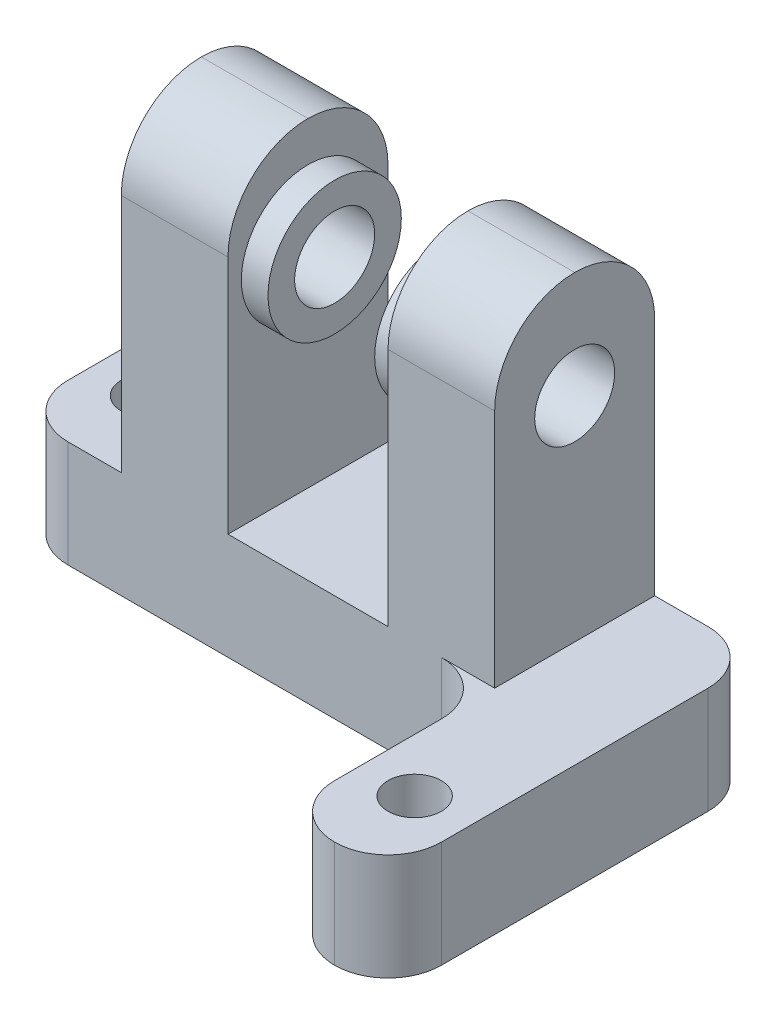
ISO-10303-21;
HEADER;
FILE_DESCRIPTION(('STEP AP214'),'2;1');
FILE_NAME('part.step','',(''),(''),'','','');
FILE_SCHEMA(('AUTOMOTIVE_DESIGN { 1 0 10303 214 1 1 1 1 }'));
ENDSEC;
DATA;
#1=APPLICATION_CONTEXT('core data for automotive mechanical design processes');
#2=APPLICATION_PROTOCOL_DEFINITION('international standard','automotive_design',2000,#1);
#3=PRODUCT_CONTEXT('',#1,'mechanical');
#4=PRODUCT('Part','Part','',(#3));
#5=PRODUCT_RELATED_PRODUCT_CATEGORY('part','',(#4));
#6=PRODUCT_DEFINITION_FORMATION('','',#4);
#7=PRODUCT_DEFINITION_CONTEXT('part definition',#1,'design');
#8=PRODUCT_DEFINITION('design','',#6,#7);
#9=PRODUCT_DEFINITION_SHAPE('','',#8);
#10=(LENGTH_UNIT() NAMED_UNIT(*) SI_UNIT(.MILLI.,.METRE.));
#11=(NAMED_UNIT(*) PLANE_ANGLE_UNIT() SI_UNIT($,.RADIAN.));
#12=(NAMED_UNIT(*) SI_UNIT($,.STERADIAN.) SOLID_ANGLE_UNIT());
#13=UNCERTAINTY_MEASURE_WITH_UNIT(LENGTH_MEASURE(1.E-05),#10,'distance_accuracy_value','');
#14=(GEOMETRIC_REPRESENTATION_CONTEXT(3) GLOBAL_UNCERTAINTY_ASSIGNED_CONTEXT((#13)) GLOBAL_UNIT_ASSIGNED_CONTEXT((#10,
#11,#12)) REPRESENTATION_CONTEXT('',''));
#15=CARTESIAN_POINT('',(0.,0.,0.));
#16=DIRECTION('',(0.,0.,1.));
#17=DIRECTION('',(1.,0.,0.));
#18=AXIS2_PLACEMENT_3D('',#15,#16,#17);
#19=CARTESIAN_POINT('',(-7.,4.,-3.));
#20=DIRECTION('',(1.,0.,0.));
#21=DIRECTION('',(0.,0.,-1.));
#22=AXIS2_PLACEMENT_3D('',#19,#20,#21);
#23=PLANE('',#22);
#24=CARTESIAN_POINT('',(-7.,12.,0.));
#25=DIRECTION('',(1.,0.,0.));
#26=DIRECTION('',(0.,0.,-1.));
#27=AXIS2_PLACEMENT_3D('',#24,#25,#26);
#28=CIRCLE('',#27,1.5);
#29=CARTESIAN_POINT('',(-7.,12.,-1.5));
#30=VERTEX_POINT('',#29);
#31=EDGE_CURVE('E254',#30,#30,#28,.T.);
#32=ORIENTED_EDGE('',*,*,#31,.T.);
#33=EDGE_LOOP('',(#32));
#34=FACE_BOUND('',#33,.T.);
#35=CARTESIAN_POINT('',(-7.,13.,0.));
#36=DIRECTION('',(1.,0.,0.));
#37=DIRECTION('',(0.,0.,-1.));
#38=AXIS2_PLACEMENT_3D('',#35,#36,#37);
#39=CIRCLE('',#38,3.);
#40=CARTESIAN_POINT('',(-7.,13.,3.));
#41=VERTEX_POINT('',#40);
#42=CARTESIAN_POINT('',(-7.,16.,0.));
#43=VERTEX_POINT('',#42);
#44=EDGE_CURVE('E346',#41,#43,#39,.F.);
#45=ORIENTED_EDGE('',*,*,#44,.T.);
#46=CARTESIAN_POINT('',(-7.,13.,0.));
#47=DIRECTION('',(1.,0.,0.));
#48=DIRECTION('',(0.,0.,-1.));
#49=AXIS2_PLACEMENT_3D('',#46,#47,#48);
#50=CIRCLE('',#49,3.);
#51=CARTESIAN_POINT('',(-7.,13.,-3.));
#52=VERTEX_POINT('',#51);
#53=EDGE_CURVE('E184',#43,#52,#50,.F.);
#54=ORIENTED_EDGE('',*,*,#53,.T.);
#55=DIRECTION('',(0.,-1.,0.));
#56=VECTOR('',#55,1.);
#57=CARTESIAN_POINT('',(-7.,4.,-3.));
#58=LINE('',#57,#56);
#59=CARTESIAN_POINT('',(-7.,4.,-3.));
#60=VERTEX_POINT('',#59);
#61=EDGE_CURVE('E178',#52,#60,#58,.T.);
#62=ORIENTED_EDGE('',*,*,#61,.T.);
#63=DIRECTION('',(0.,0.,-1.));
#64=VECTOR('',#63,1.);
#65=CARTESIAN_POINT('',(-7.,4.,3.));
#66=LINE('',#65,#64);
#67=CARTESIAN_POINT('',(-7.,4.,3.));
#68=VERTEX_POINT('',#67);
#69=EDGE_CURVE('E182',#68,#60,#66,.T.);
#70=ORIENTED_EDGE('',*,*,#69,.F.);
#71=DIRECTION('',(0.,-1.,0.));
#72=VECTOR('',#71,1.);
#73=CARTESIAN_POINT('',(-7.,4.,3.));
#74=LINE('',#73,#72);
#75=EDGE_CURVE('E189',#41,#68,#74,.T.);
#76=ORIENTED_EDGE('',*,*,#75,.F.);
#77=EDGE_LOOP('',(#45,#54,#62,#70,#76));
#78=FACE_BOUND('',#77,.T.);
#79=ADVANCED_FACE('F36',(#34,#78),#23,.F.);
#80=CARTESIAN_POINT('',(7.,4.,-3.));
#81=DIRECTION('',(-1.,0.,0.));
#82=DIRECTION('',(0.,0.,1.));
#83=AXIS2_PLACEMENT_3D('',#80,#81,#82);
#84=PLANE('',#83);
#85=CARTESIAN_POINT('',(7.,12.,0.));
#86=DIRECTION('',(-1.,0.,0.));
#87=DIRECTION('',(0.,0.,1.));
#88=AXIS2_PLACEMENT_3D('',#85,#86,#87);
#89=CIRCLE('',#88,1.5);
#90=CARTESIAN_POINT('',(7.,12.,1.5));
#91=VERTEX_POINT('',#90);
#92=EDGE_CURVE('E257',#91,#91,#89,.T.);
#93=ORIENTED_EDGE('',*,*,#92,.T.);
#94=EDGE_LOOP('',(#93));
#95=FACE_BOUND('',#94,.T.);
#96=DIRECTION('',(0.,-1.,0.));
#97=VECTOR('',#96,1.);
#98=CARTESIAN_POINT('',(7.,4.,-3.));
#99=LINE('',#98,#97);
#100=CARTESIAN_POINT('',(7.,13.,-3.));
#101=VERTEX_POINT('',#100);
#102=CARTESIAN_POINT('',(7.,4.,-3.));
#103=VERTEX_POINT('',#102);
#104=EDGE_CURVE('E188',#101,#103,#99,.T.);
#105=ORIENTED_EDGE('',*,*,#104,.F.);
#106=CARTESIAN_POINT('',(7.,13.,0.));
#107=DIRECTION('',(-1.,0.,0.));
#108=DIRECTION('',(0.,0.,1.));
#109=AXIS2_PLACEMENT_3D('',#106,#107,#108);
#110=CIRCLE('',#109,3.);
#111=CARTESIAN_POINT('',(7.,16.,0.));
#112=VERTEX_POINT('',#111);
#113=EDGE_CURVE('E58',#101,#112,#110,.F.);
#114=ORIENTED_EDGE('',*,*,#113,.T.);
#115=CARTESIAN_POINT('',(7.,13.,0.));
#116=DIRECTION('',(-1.,0.,0.));
#117=DIRECTION('',(0.,0.,1.));
#118=AXIS2_PLACEMENT_3D('',#115,#116,#117);
#119=CIRCLE('',#118,3.);
#120=CARTESIAN_POINT('',(7.,13.,3.));
#121=VERTEX_POINT('',#120);
#122=EDGE_CURVE('E53',#112,#121,#119,.F.);
#123=ORIENTED_EDGE('',*,*,#122,.T.);
#124=DIRECTION('',(0.,-1.,0.));
#125=VECTOR('',#124,1.);
#126=CARTESIAN_POINT('',(7.,4.,3.));
#127=LINE('',#126,#125);
#128=CARTESIAN_POINT('',(7.,4.,3.));
#129=VERTEX_POINT('',#128);
#130=EDGE_CURVE('E282',#121,#129,#127,.T.);
#131=ORIENTED_EDGE('',*,*,#130,.T.);
#132=DIRECTION('',(0.,0.,1.));
#133=VECTOR('',#132,1.);
#134=CARTESIAN_POINT('',(7.,4.,-3.));
#135=LINE('',#134,#133);
#136=EDGE_CURVE('E231',#103,#129,#135,.T.);
#137=ORIENTED_EDGE('',*,*,#136,.F.);
#138=EDGE_LOOP('',(#105,#114,#123,#131,#137));
#139=FACE_BOUND('',#138,.T.);
#140=ADVANCED_FACE('F453',(#95,#139),#84,.F.);
#141=CARTESIAN_POINT('',(3.,16.,3.));
#142=DIRECTION('',(1.,0.,0.));
#143=DIRECTION('',(0.,0.,-1.));
#144=AXIS2_PLACEMENT_3D('',#141,#142,#143);
#145=PLANE('',#144);
#146=CARTESIAN_POINT('',(3.,13.,0.));
#147=DIRECTION('',(1.,0.,0.));
#148=DIRECTION('',(0.,0.,-1.));
#149=AXIS2_PLACEMENT_3D('',#146,#147,#148);
#150=CIRCLE('',#149,3.);
#151=CARTESIAN_POINT('',(3.,13.,3.));
#152=VERTEX_POINT('',#151);
#153=CARTESIAN_POINT('',(3.,16.,0.));
#154=VERTEX_POINT('',#153);
#155=EDGE_CURVE('E361',#152,#154,#150,.F.);
#156=ORIENTED_EDGE('',*,*,#155,.T.);
#157=CARTESIAN_POINT('',(3.,13.,0.));
#158=DIRECTION('',(1.,0.,0.));
#159=DIRECTION('',(0.,0.,-1.));
#160=AXIS2_PLACEMENT_3D('',#157,#158,#159);
#161=CIRCLE('',#160,3.);
#162=CARTESIAN_POINT('',(3.,13.,-3.));
#163=VERTEX_POINT('',#162);
#164=EDGE_CURVE('E363',#154,#163,#161,.F.);
#165=ORIENTED_EDGE('',*,*,#164,.T.);
#166=DIRECTION('',(0.,-1.,0.));
#167=VECTOR('',#166,1.);
#168=CARTESIAN_POINT('',(3.,16.,-3.));
#169=LINE('',#168,#167);
#170=CARTESIAN_POINT('',(3.,4.,-3.));
#171=VERTEX_POINT('',#170);
#172=EDGE_CURVE('E260',#163,#171,#169,.T.);
#173=ORIENTED_EDGE('',*,*,#172,.T.);
#174=DIRECTION('',(0.,0.,1.));
#175=VECTOR('',#174,1.);
#176=CARTESIAN_POINT('',(3.,4.,3.));
#177=LINE('',#176,#175);
#178=CARTESIAN_POINT('',(3.,4.,3.));
#179=VERTEX_POINT('',#178);
#180=EDGE_CURVE('E264',#171,#179,#177,.T.);
#181=ORIENTED_EDGE('',*,*,#180,.T.);
#182=DIRECTION('',(0.,-1.,0.));
#183=VECTOR('',#182,1.);
#184=CARTESIAN_POINT('',(3.,16.,3.));
#185=LINE('',#184,#183);
#186=EDGE_CURVE('E262',#152,#179,#185,.T.);
#187=ORIENTED_EDGE('',*,*,#186,.F.);
#188=EDGE_LOOP('',(#156,#165,#173,#181,#187));
#189=FACE_BOUND('',#188,.T.);
#190=CARTESIAN_POINT('',(3.,12.,0.));
#191=DIRECTION('',(1.,0.,0.));
#192=DIRECTION('',(0.,0.,-1.));
#193=AXIS2_PLACEMENT_3D('',#190,#191,#192);
#194=CIRCLE('',#193,2.5);
#195=CARTESIAN_POINT('',(3.,12.,-2.5));
#196=VERTEX_POINT('',#195);
#197=EDGE_CURVE('E292',#196,#196,#194,.F.);
#198=ORIENTED_EDGE('',*,*,#197,.F.);
#199=EDGE_LOOP('',(#198));
#200=FACE_BOUND('',#199,.T.);
#201=ADVANCED_FACE('F384',(#189,#200),#145,.F.);
#202=CARTESIAN_POINT('',(-3.,16.,3.));
#203=DIRECTION('',(-1.,0.,0.));
#204=DIRECTION('',(0.,0.,1.));
#205=AXIS2_PLACEMENT_3D('',#202,#203,#204);
#206=PLANE('',#205);
#207=DIRECTION('',(0.,-1.,0.));
#208=VECTOR('',#207,1.);
#209=CARTESIAN_POINT('',(-3.,16.,-3.));
#210=LINE('',#209,#208);
#211=CARTESIAN_POINT('',(-3.,13.,-3.));
#212=VERTEX_POINT('',#211);
#213=CARTESIAN_POINT('',(-3.,4.,-3.));
#214=VERTEX_POINT('',#213);
#215=EDGE_CURVE('E270',#212,#214,#210,.T.);
#216=ORIENTED_EDGE('',*,*,#215,.F.);
#217=CARTESIAN_POINT('',(-3.,13.,0.));
#218=DIRECTION('',(-1.,0.,0.));
#219=DIRECTION('',(0.,0.,1.));
#220=AXIS2_PLACEMENT_3D('',#217,#218,#219);
#221=CIRCLE('',#220,3.);
#222=CARTESIAN_POINT('',(-3.,16.,0.));
#223=VERTEX_POINT('',#222);
#224=EDGE_CURVE('E359',#212,#223,#221,.F.);
#225=ORIENTED_EDGE('',*,*,#224,.T.);
#226=CARTESIAN_POINT('',(-3.,13.,0.));
#227=DIRECTION('',(-1.,0.,0.));
#228=DIRECTION('',(0.,0.,1.));
#229=AXIS2_PLACEMENT_3D('',#226,#227,#228);
#230=CIRCLE('',#229,3.);
#231=CARTESIAN_POINT('',(-3.,13.,3.));
#232=VERTEX_POINT('',#231);
#233=EDGE_CURVE('E357',#223,#232,#230,.F.);
#234=ORIENTED_EDGE('',*,*,#233,.T.);
#235=DIRECTION('',(0.,-1.,0.));
#236=VECTOR('',#235,1.);
#237=CARTESIAN_POINT('',(-3.,16.,3.));
#238=LINE('',#237,#236);
#239=CARTESIAN_POINT('',(-3.,4.,3.));
#240=VERTEX_POINT('',#239);
#241=EDGE_CURVE('E272',#232,#240,#238,.T.);
#242=ORIENTED_EDGE('',*,*,#241,.T.);
#243=DIRECTION('',(0.,0.,-1.));
#244=VECTOR('',#243,1.);
#245=CARTESIAN_POINT('',(-3.,4.,3.));
#246=LINE('',#245,#244);
#247=EDGE_CURVE('E267',#240,#214,#246,.T.);
#248=ORIENTED_EDGE('',*,*,#247,.T.);
#249=EDGE_LOOP('',(#216,#225,#234,#242,#248));
#250=FACE_BOUND('',#249,.T.);
#251=CARTESIAN_POINT('',(-3.,12.,0.));
#252=DIRECTION('',(-1.,0.,0.));
#253=DIRECTION('',(0.,0.,1.));
#254=AXIS2_PLACEMENT_3D('',#251,#252,#253);
#255=CIRCLE('',#254,2.5);
#256=CARTESIAN_POINT('',(-3.,12.,2.5));
#257=VERTEX_POINT('',#256);
#258=EDGE_CURVE('E289',#257,#257,#255,.F.);
#259=ORIENTED_EDGE('',*,*,#258,.F.);
#260=EDGE_LOOP('',(#259));
#261=FACE_BOUND('',#260,.T.);
#262=ADVANCED_FACE('F394',(#250,#261),#206,.F.);
#263=CARTESIAN_POINT('',(0.,4.,0.));
#264=DIRECTION('',(0.,1.,0.));
#265=DIRECTION('',(0.,0.,1.));
#266=AXIS2_PLACEMENT_3D('',#263,#264,#265);
#267=PLANE('',#266);
#268=DIRECTION('',(1.,0.,0.));
#269=VECTOR('',#268,1.);
#270=CARTESIAN_POINT('',(-7.,4.,3.));
#271=LINE('',#270,#269);
#272=EDGE_CURVE('E278',#240,#179,#271,.T.);
#273=ORIENTED_EDGE('',*,*,#272,.T.);
#274=ORIENTED_EDGE('',*,*,#180,.F.);
#275=DIRECTION('',(-1.,0.,0.));
#276=VECTOR('',#275,1.);
#277=CARTESIAN_POINT('',(-7.,4.,-3.));
#278=LINE('',#277,#276);
#279=EDGE_CURVE('E275',#171,#214,#278,.T.);
#280=ORIENTED_EDGE('',*,*,#279,.T.);
#281=ORIENTED_EDGE('',*,*,#247,.F.);
#282=EDGE_LOOP('',(#273,#274,#280,#281));
#283=FACE_BOUND('',#282,.T.);
#284=ADVANCED_FACE('F390',(#283),#267,.T.);
#285=CARTESIAN_POINT('',(-7.,4.,-3.));
#286=DIRECTION('',(0.,0.,1.));
#287=DIRECTION('',(1.,0.,0.));
#288=AXIS2_PLACEMENT_3D('',#285,#286,#287);
#289=PLANE('',#288);
#290=ORIENTED_EDGE('',*,*,#61,.F.);
#291=DIRECTION('',(-1.,0.,0.));
#292=VECTOR('',#291,1.);
#293=CARTESIAN_POINT('',(-3.,13.,-3.));
#294=LINE('',#293,#292);
#295=EDGE_CURVE('E355',#52,#212,#294,.F.);
#296=ORIENTED_EDGE('',*,*,#295,.T.);
#297=ORIENTED_EDGE('',*,*,#215,.T.);
#298=ORIENTED_EDGE('',*,*,#279,.F.);
#299=ORIENTED_EDGE('',*,*,#172,.F.);
#300=DIRECTION('',(-1.,0.,0.));
#301=VECTOR('',#300,1.);
#302=CARTESIAN_POINT('',(-7.,13.,-3.));
#303=LINE('',#302,#301);
#304=EDGE_CURVE('E352',#163,#101,#303,.F.);
#305=ORIENTED_EDGE('',*,*,#304,.T.);
#306=ORIENTED_EDGE('',*,*,#104,.T.);
#307=DIRECTION('',(-1.,0.,0.));
#308=VECTOR('',#307,1.);
#309=CARTESIAN_POINT('',(11.,4.,-3.));
#310=LINE('',#309,#308);
#311=CARTESIAN_POINT('',(9.,4.,-3.));
#312=VERTEX_POINT('',#311);
#313=EDGE_CURVE('E237',#312,#103,#310,.T.);
#314=ORIENTED_EDGE('',*,*,#313,.F.);
#315=DIRECTION('',(0.,1.,0.));
#316=VECTOR('',#315,1.);
#317=CARTESIAN_POINT('',(9.,0.,-3.));
#318=LINE('',#317,#316);
#319=CARTESIAN_POINT('',(8.99999999999999,0.,-3.));
#320=VERTEX_POINT('',#319);
#321=EDGE_CURVE('E340',#312,#320,#318,.F.);
#322=ORIENTED_EDGE('',*,*,#321,.T.);
#323=DIRECTION('',(-1.,0.,0.));
#324=VECTOR('',#323,1.);
#325=CARTESIAN_POINT('',(-7.,0.,-3.));
#326=LINE('',#325,#324);
#327=CARTESIAN_POINT('',(-9.,0.,-3.));
#328=VERTEX_POINT('',#327);
#329=EDGE_CURVE('E274',#320,#328,#326,.T.);
#330=ORIENTED_EDGE('',*,*,#329,.T.);
#331=DIRECTION('',(0.,1.,0.));
#332=VECTOR('',#331,1.);
#333=CARTESIAN_POINT('',(-9.,4.,-3.));
#334=LINE('',#333,#332);
#335=CARTESIAN_POINT('',(-9.,4.,-3.));
#336=VERTEX_POINT('',#335);
#337=EDGE_CURVE('E197',#328,#336,#334,.T.);
#338=ORIENTED_EDGE('',*,*,#337,.T.);
#339=DIRECTION('',(-1.,0.,0.));
#340=VECTOR('',#339,1.);
#341=CARTESIAN_POINT('',(-7.,4.,-3.));
#342=LINE('',#341,#340);
#343=EDGE_CURVE('E193',#60,#336,#342,.T.);
#344=ORIENTED_EDGE('',*,*,#343,.F.);
#345=EDGE_LOOP('',(#290,#296,#297,#298,#299,#305,#306,#314,#322,#330,#338,#344));
#346=FACE_BOUND('',#345,.T.);
#347=ADVANCED_FACE('F194',(#346),#289,.F.);
#348=CARTESIAN_POINT('',(-7.,4.,3.));
#349=DIRECTION('',(0.,0.,-1.));
#350=DIRECTION('',(-1.,0.,0.));
#351=AXIS2_PLACEMENT_3D('',#348,#349,#350);
#352=PLANE('',#351);
#353=ORIENTED_EDGE('',*,*,#130,.F.);
#354=DIRECTION('',(1.,0.,0.));
#355=VECTOR('',#354,1.);
#356=CARTESIAN_POINT('',(-7.,13.,3.));
#357=LINE('',#356,#355);
#358=EDGE_CURVE('E11',#121,#152,#357,.F.);
#359=ORIENTED_EDGE('',*,*,#358,.T.);
#360=ORIENTED_EDGE('',*,*,#186,.T.);
#361=ORIENTED_EDGE('',*,*,#272,.F.);
#362=ORIENTED_EDGE('',*,*,#241,.F.);
#363=DIRECTION('',(1.,0.,0.));
#364=VECTOR('',#363,1.);
#365=CARTESIAN_POINT('',(-7.,13.,3.));
#366=LINE('',#365,#364);
#367=EDGE_CURVE('E45',#232,#41,#366,.F.);
#368=ORIENTED_EDGE('',*,*,#367,.T.);
#369=ORIENTED_EDGE('',*,*,#75,.T.);
#370=DIRECTION('',(1.,0.,0.));
#371=VECTOR('',#370,1.);
#372=CARTESIAN_POINT('',(-11.,4.,3.));
#373=LINE('',#372,#371);
#374=CARTESIAN_POINT('',(-9.,4.,3.));
#375=VERTEX_POINT('',#374);
#376=EDGE_CURVE('E205',#375,#68,#373,.T.);
#377=ORIENTED_EDGE('',*,*,#376,.F.);
#378=DIRECTION('',(0.,1.,0.));
#379=VECTOR('',#378,1.);
#380=CARTESIAN_POINT('',(-9.,0.,3.));
#381=LINE('',#380,#379);
#382=CARTESIAN_POINT('',(-9.,0.,3.));
#383=VERTEX_POINT('',#382);
#384=EDGE_CURVE('E300',#375,#383,#381,.F.);
#385=ORIENTED_EDGE('',*,*,#384,.T.);
#386=DIRECTION('',(1.,0.,0.));
#387=VECTOR('',#386,1.);
#388=CARTESIAN_POINT('',(-7.,0.,3.));
#389=LINE('',#388,#387);
#390=CARTESIAN_POINT('',(5.,0.,3.));
#391=VERTEX_POINT('',#390);
#392=EDGE_CURVE('E279',#383,#391,#389,.T.);
#393=ORIENTED_EDGE('',*,*,#392,.T.);
#394=DIRECTION('',(0.,-1.,0.));
#395=VECTOR('',#394,1.);
#396=CARTESIAN_POINT('',(5.,4.,3.));
#397=LINE('',#396,#395);
#398=CARTESIAN_POINT('',(5.,4.,3.));
#399=VERTEX_POINT('',#398);
#400=EDGE_CURVE('E305',#391,#399,#397,.F.);
#401=ORIENTED_EDGE('',*,*,#400,.T.);
#402=DIRECTION('',(1.,0.,0.));
#403=VECTOR('',#402,1.);
#404=CARTESIAN_POINT('',(-7.,4.,3.));
#405=LINE('',#404,#403);
#406=EDGE_CURVE('E302',#399,#129,#405,.T.);
#407=ORIENTED_EDGE('',*,*,#406,.T.);
#408=EDGE_LOOP('',(#353,#359,#360,#361,#362,#368,#369,#377,#385,#393,#401,#407));
#409=FACE_BOUND('',#408,.T.);
#410=ADVANCED_FACE('F381',(#409),#352,.F.);
#411=CARTESIAN_POINT('',(0.,0.,0.));
#412=DIRECTION('',(0.,1.,0.));
#413=DIRECTION('',(0.,0.,1.));
#414=AXIS2_PLACEMENT_3D('',#411,#412,#413);
#415=PLANE('',#414);
#416=DIRECTION('',(0.,0.,-1.));
#417=VECTOR('',#416,1.);
#418=CARTESIAN_POINT('',(11.,0.,3.));
#419=LINE('',#418,#417);
#420=CARTESIAN_POINT('',(11.,0.,9.));
#421=VERTEX_POINT('',#420);
#422=CARTESIAN_POINT('',(11.,0.,-1.));
#423=VERTEX_POINT('',#422);
#424=EDGE_CURVE('E230',#421,#423,#419,.T.);
#425=ORIENTED_EDGE('',*,*,#424,.F.);
#426=CARTESIAN_POINT('',(9.,0.,9.));
#427=DIRECTION('',(0.,1.,0.));
#428=DIRECTION('',(0.,0.,1.));
#429=AXIS2_PLACEMENT_3D('',#426,#427,#428);
#430=CIRCLE('',#429,2.);
#431=CARTESIAN_POINT('',(9.,0.,11.));
#432=VERTEX_POINT('',#431);
#433=EDGE_CURVE('E328',#421,#432,#430,.F.);
#434=ORIENTED_EDGE('',*,*,#433,.T.);
#435=CARTESIAN_POINT('',(9.,0.,9.));
#436=DIRECTION('',(0.,1.,0.));
#437=DIRECTION('',(0.,0.,1.));
#438=AXIS2_PLACEMENT_3D('',#435,#436,#437);
#439=CIRCLE('',#438,2.);
#440=CARTESIAN_POINT('',(7.,0.,9.));
#441=VERTEX_POINT('',#440);
#442=EDGE_CURVE('E326',#432,#441,#439,.F.);
#443=ORIENTED_EDGE('',*,*,#442,.T.);
#444=DIRECTION('',(0.,0.,1.));
#445=VECTOR('',#444,1.);
#446=CARTESIAN_POINT('',(7.,0.,11.));
#447=LINE('',#446,#445);
#448=CARTESIAN_POINT('',(7.,0.,5.));
#449=VERTEX_POINT('',#448);
#450=EDGE_CURVE('E227',#449,#441,#447,.T.);
#451=ORIENTED_EDGE('',*,*,#450,.F.);
#452=CARTESIAN_POINT('',(5.,0.,5.));
#453=DIRECTION('',(0.,1.,0.));
#454=DIRECTION('',(0.,0.,1.));
#455=AXIS2_PLACEMENT_3D('',#452,#453,#454);
#456=CIRCLE('',#455,2.);
#457=EDGE_CURVE('E342',#449,#391,#456,.T.);
#458=ORIENTED_EDGE('',*,*,#457,.T.);
#459=ORIENTED_EDGE('',*,*,#392,.F.);
#460=CARTESIAN_POINT('',(-9.,0.,1.));
#461=DIRECTION('',(0.,1.,0.));
#462=DIRECTION('',(0.,0.,1.));
#463=AXIS2_PLACEMENT_3D('',#460,#461,#462);
#464=CIRCLE('',#463,2.);
#465=CARTESIAN_POINT('',(-11.,0.,1.));
#466=VERTEX_POINT('',#465);
#467=EDGE_CURVE('E324',#383,#466,#464,.F.);
#468=ORIENTED_EDGE('',*,*,#467,.T.);
#469=DIRECTION('',(0.,0.,1.));
#470=VECTOR('',#469,1.);
#471=CARTESIAN_POINT('',(-11.,0.,-3.));
#472=LINE('',#471,#470);
#473=CARTESIAN_POINT('',(-11.,0.,-1.));
#474=VERTEX_POINT('',#473);
#475=EDGE_CURVE('E211',#474,#466,#472,.T.);
#476=ORIENTED_EDGE('',*,*,#475,.F.);
#477=CARTESIAN_POINT('',(-9.,0.,-1.));
#478=DIRECTION('',(0.,1.,0.));
#479=DIRECTION('',(0.,0.,1.));
#480=AXIS2_PLACEMENT_3D('',#477,#478,#479);
#481=CIRCLE('',#480,2.);
#482=EDGE_CURVE('E320',#474,#328,#481,.F.);
#483=ORIENTED_EDGE('',*,*,#482,.T.);
#484=ORIENTED_EDGE('',*,*,#329,.F.);
#485=CARTESIAN_POINT('',(9.,0.,-1.));
#486=DIRECTION('',(0.,1.,0.));
#487=DIRECTION('',(0.,0.,1.));
#488=AXIS2_PLACEMENT_3D('',#485,#486,#487);
#489=CIRCLE('',#488,2.);
#490=EDGE_CURVE('E322',#320,#423,#489,.F.);
#491=ORIENTED_EDGE('',*,*,#490,.T.);
#492=EDGE_LOOP('',(#425,#434,#443,#451,#458,#459,#468,#476,#483,#484,#491));
#493=FACE_BOUND('',#492,.T.);
#494=CARTESIAN_POINT('',(9.,0.,8.));
#495=DIRECTION('',(0.,1.,0.));
#496=DIRECTION('',(0.,0.,1.));
#497=AXIS2_PLACEMENT_3D('',#494,#495,#496);
#498=CIRCLE('',#497,1.);
#499=CARTESIAN_POINT('',(9.,0.,9.));
#500=VERTEX_POINT('',#499);
#501=EDGE_CURVE('E221',#500,#500,#498,.T.);
#502=ORIENTED_EDGE('',*,*,#501,.T.);
#503=EDGE_LOOP('',(#502));
#504=FACE_BOUND('',#503,.T.);
#505=CARTESIAN_POINT('',(-9.,0.,0.));
#506=DIRECTION('',(0.,1.,0.));
#507=DIRECTION('',(0.,0.,1.));
#508=AXIS2_PLACEMENT_3D('',#505,#506,#507);
#509=CIRCLE('',#508,1.);
#510=CARTESIAN_POINT('',(-9.,0.,1.));
#511=VERTEX_POINT('',#510);
#512=EDGE_CURVE('E207',#511,#511,#509,.T.);
#513=ORIENTED_EDGE('',*,*,#512,.T.);
#514=EDGE_LOOP('',(#513));
#515=FACE_BOUND('',#514,.T.);
#516=ADVANCED_FACE('F411',(#493,#504,#515),#415,.F.);
#517=CARTESIAN_POINT('',(-7.,12.,0.));
#518=DIRECTION('',(1.,0.,0.));
#519=DIRECTION('',(0.,0.,-1.));
#520=AXIS2_PLACEMENT_3D('',#517,#518,#519);
#521=CYLINDRICAL_SURFACE('',#520,1.5);
#522=ORIENTED_EDGE('',*,*,#92,.F.);
#523=EDGE_LOOP('',(#522));
#524=FACE_BOUND('',#523,.T.);
#525=CARTESIAN_POINT('',(2.,12.,0.));
#526=DIRECTION('',(-1.,0.,0.));
#527=DIRECTION('',(0.,0.,1.));
#528=AXIS2_PLACEMENT_3D('',#525,#526,#527);
#529=CIRCLE('',#528,1.5);
#530=CARTESIAN_POINT('',(2.,12.,1.5));
#531=VERTEX_POINT('',#530);
#532=EDGE_CURVE('E234',#531,#531,#529,.T.);
#533=ORIENTED_EDGE('',*,*,#532,.T.);
#534=EDGE_LOOP('',(#533));
#535=FACE_BOUND('',#534,.T.);
#536=ADVANCED_FACE('F611',(#524,#535),#521,.F.);
#537=ORIENTED_EDGE('',*,*,#31,.F.);
#538=EDGE_LOOP('',(#537));
#539=FACE_BOUND('',#538,.T.);
#540=CARTESIAN_POINT('',(-2.,12.,0.));
#541=DIRECTION('',(1.,0.,0.));
#542=DIRECTION('',(0.,0.,-1.));
#543=AXIS2_PLACEMENT_3D('',#540,#541,#542);
#544=CIRCLE('',#543,1.5);
#545=CARTESIAN_POINT('',(-2.,12.,-1.5));
#546=VERTEX_POINT('',#545);
#547=EDGE_CURVE('E248',#546,#546,#544,.T.);
#548=ORIENTED_EDGE('',*,*,#547,.T.);
#549=EDGE_LOOP('',(#548));
#550=FACE_BOUND('',#549,.T.);
#551=ADVANCED_FACE('F603',(#539,#550),#521,.F.);
#552=CARTESIAN_POINT('',(-2.,12.,0.));
#553=DIRECTION('',(1.,0.,0.));
#554=DIRECTION('',(0.,0.,-1.));
#555=AXIS2_PLACEMENT_3D('',#552,#553,#554);
#556=PLANE('',#555);
#557=CARTESIAN_POINT('',(-2.,12.,0.));
#558=DIRECTION('',(1.,0.,0.));
#559=DIRECTION('',(0.,0.,-1.));
#560=AXIS2_PLACEMENT_3D('',#557,#558,#559);
#561=CIRCLE('',#560,2.5);
#562=CARTESIAN_POINT('',(-2.,12.,-2.5));
#563=VERTEX_POINT('',#562);
#564=EDGE_CURVE('E251',#563,#563,#561,.T.);
#565=ORIENTED_EDGE('',*,*,#564,.T.);
#566=EDGE_LOOP('',(#565));
#567=FACE_BOUND('',#566,.T.);
#568=ORIENTED_EDGE('',*,*,#547,.F.);
#569=EDGE_LOOP('',(#568));
#570=FACE_BOUND('',#569,.T.);
#571=ADVANCED_FACE('F595',(#567,#570),#556,.T.);
#572=CARTESIAN_POINT('',(-2.,12.,0.));
#573=DIRECTION('',(-1.,0.,0.));
#574=DIRECTION('',(0.,0.,1.));
#575=AXIS2_PLACEMENT_3D('',#572,#573,#574);
#576=CYLINDRICAL_SURFACE('',#575,2.5);
#577=ORIENTED_EDGE('',*,*,#564,.F.);
#578=EDGE_LOOP('',(#577));
#579=FACE_BOUND('',#578,.T.);
#580=ORIENTED_EDGE('',*,*,#258,.T.);
#581=EDGE_LOOP('',(#580));
#582=FACE_BOUND('',#581,.T.);
#583=ADVANCED_FACE('F586',(#579,#582),#576,.T.);
#584=CARTESIAN_POINT('',(2.,12.,0.));
#585=DIRECTION('',(-1.,0.,0.));
#586=DIRECTION('',(0.,0.,1.));
#587=AXIS2_PLACEMENT_3D('',#584,#585,#586);
#588=PLANE('',#587);
#589=CARTESIAN_POINT('',(2.,12.,0.));
#590=DIRECTION('',(-1.,0.,0.));
#591=DIRECTION('',(0.,0.,1.));
#592=AXIS2_PLACEMENT_3D('',#589,#590,#591);
#593=CIRCLE('',#592,2.5);
#594=CARTESIAN_POINT('',(2.,12.,2.5));
#595=VERTEX_POINT('',#594);
#596=EDGE_CURVE('E245',#595,#595,#593,.T.);
#597=ORIENTED_EDGE('',*,*,#596,.T.);
#598=EDGE_LOOP('',(#597));
#599=FACE_BOUND('',#598,.T.);
#600=ORIENTED_EDGE('',*,*,#532,.F.);
#601=EDGE_LOOP('',(#600));
#602=FACE_BOUND('',#601,.T.);
#603=ADVANCED_FACE('F578',(#599,#602),#588,.T.);
#604=CARTESIAN_POINT('',(2.,12.,0.));
#605=DIRECTION('',(1.,0.,0.));
#606=DIRECTION('',(0.,0.,-1.));
#607=AXIS2_PLACEMENT_3D('',#604,#605,#606);
#608=CYLINDRICAL_SURFACE('',#607,2.5);
#609=ORIENTED_EDGE('',*,*,#596,.F.);
#610=EDGE_LOOP('',(#609));
#611=FACE_BOUND('',#610,.T.);
#612=ORIENTED_EDGE('',*,*,#197,.T.);
#613=EDGE_LOOP('',(#612));
#614=FACE_BOUND('',#613,.T.);
#615=ADVANCED_FACE('F572',(#611,#614),#608,.T.);
#616=CARTESIAN_POINT('',(7.,0.,-3.));
#617=DIRECTION('',(-1.,0.,0.));
#618=DIRECTION('',(0.,0.,1.));
#619=AXIS2_PLACEMENT_3D('',#616,#617,#618);
#620=PLANE('',#619);
#621=CARTESIAN_POINT('',(7.,4.,5.));
#622=VERTEX_POINT('',#621);
#623=CARTESIAN_POINT('',(7.,4.,9.));
#624=VERTEX_POINT('',#623);
#625=EDGE_CURVE('E240',#622,#624,#135,.T.);
#626=ORIENTED_EDGE('',*,*,#625,.F.);
#627=DIRECTION('',(0.,-1.,0.));
#628=VECTOR('',#627,1.);
#629=CARTESIAN_POINT('',(7.,0.,5.));
#630=LINE('',#629,#628);
#631=EDGE_CURVE('E297',#622,#449,#630,.T.);
#632=ORIENTED_EDGE('',*,*,#631,.T.);
#633=ORIENTED_EDGE('',*,*,#450,.T.);
#634=DIRECTION('',(0.,1.,0.));
#635=VECTOR('',#634,1.);
#636=CARTESIAN_POINT('',(7.,0.,9.));
#637=LINE('',#636,#635);
#638=EDGE_CURVE('E295',#441,#624,#637,.T.);
#639=ORIENTED_EDGE('',*,*,#638,.T.);
#640=EDGE_LOOP('',(#626,#632,#633,#639));
#641=FACE_BOUND('',#640,.T.);
#642=ADVANCED_FACE('F444',(#641),#620,.T.);
#643=CARTESIAN_POINT('',(11.,0.,-3.));
#644=DIRECTION('',(1.,0.,0.));
#645=DIRECTION('',(0.,0.,-1.));
#646=AXIS2_PLACEMENT_3D('',#643,#644,#645);
#647=PLANE('',#646);
#648=DIRECTION('',(0.,0.,-1.));
#649=VECTOR('',#648,1.);
#650=CARTESIAN_POINT('',(11.,4.,-3.));
#651=LINE('',#650,#649);
#652=CARTESIAN_POINT('',(11.,4.,9.));
#653=VERTEX_POINT('',#652);
#654=CARTESIAN_POINT('',(11.,4.,-1.));
#655=VERTEX_POINT('',#654);
#656=EDGE_CURVE('E224',#653,#655,#651,.T.);
#657=ORIENTED_EDGE('',*,*,#656,.F.);
#658=DIRECTION('',(0.,1.,0.));
#659=VECTOR('',#658,1.);
#660=CARTESIAN_POINT('',(11.,0.,9.));
#661=LINE('',#660,#659);
#662=EDGE_CURVE('E317',#653,#421,#661,.F.);
#663=ORIENTED_EDGE('',*,*,#662,.T.);
#664=ORIENTED_EDGE('',*,*,#424,.T.);
#665=DIRECTION('',(0.,1.,0.));
#666=VECTOR('',#665,1.);
#667=CARTESIAN_POINT('',(11.,4.,-1.));
#668=LINE('',#667,#666);
#669=EDGE_CURVE('E314',#423,#655,#668,.T.);
#670=ORIENTED_EDGE('',*,*,#669,.T.);
#671=EDGE_LOOP('',(#657,#663,#664,#670));
#672=FACE_BOUND('',#671,.T.);
#673=ADVANCED_FACE('F429',(#672),#647,.T.);
#674=CARTESIAN_POINT('',(0.,4.,0.));
#675=DIRECTION('',(0.,1.,0.));
#676=DIRECTION('',(0.,0.,1.));
#677=AXIS2_PLACEMENT_3D('',#674,#675,#676);
#678=PLANE('',#677);
#679=CARTESIAN_POINT('',(9.,4.,8.));
#680=DIRECTION('',(0.,1.,0.));
#681=DIRECTION('',(0.,0.,1.));
#682=AXIS2_PLACEMENT_3D('',#679,#680,#681);
#683=CIRCLE('',#682,1.);
#684=CARTESIAN_POINT('',(9.,4.,9.));
#685=VERTEX_POINT('',#684);
#686=EDGE_CURVE('E218',#685,#685,#683,.T.);
#687=ORIENTED_EDGE('',*,*,#686,.F.);
#688=EDGE_LOOP('',(#687));
#689=FACE_BOUND('',#688,.T.);
#690=CARTESIAN_POINT('',(9.,4.,9.));
#691=DIRECTION('',(0.,1.,0.));
#692=DIRECTION('',(0.,0.,1.));
#693=AXIS2_PLACEMENT_3D('',#690,#691,#692);
#694=CIRCLE('',#693,2.);
#695=CARTESIAN_POINT('',(9.,4.,11.));
#696=VERTEX_POINT('',#695);
#697=EDGE_CURVE('E310',#624,#696,#694,.T.);
#698=ORIENTED_EDGE('',*,*,#697,.T.);
#699=CARTESIAN_POINT('',(9.,4.,9.));
#700=DIRECTION('',(0.,1.,0.));
#701=DIRECTION('',(0.,0.,1.));
#702=AXIS2_PLACEMENT_3D('',#699,#700,#701);
#703=CIRCLE('',#702,2.);
#704=EDGE_CURVE('E312',#696,#653,#703,.T.);
#705=ORIENTED_EDGE('',*,*,#704,.T.);
#706=ORIENTED_EDGE('',*,*,#656,.T.);
#707=CARTESIAN_POINT('',(9.,4.,-1.));
#708=DIRECTION('',(0.,1.,0.));
#709=DIRECTION('',(0.,0.,1.));
#710=AXIS2_PLACEMENT_3D('',#707,#708,#709);
#711=CIRCLE('',#710,2.);
#712=EDGE_CURVE('E308',#655,#312,#711,.T.);
#713=ORIENTED_EDGE('',*,*,#712,.T.);
#714=ORIENTED_EDGE('',*,*,#313,.T.);
#715=ORIENTED_EDGE('',*,*,#136,.T.);
#716=ORIENTED_EDGE('',*,*,#406,.F.);
#717=CARTESIAN_POINT('',(5.,4.,5.));
#718=DIRECTION('',(0.,1.,0.));
#719=DIRECTION('',(0.,0.,1.));
#720=AXIS2_PLACEMENT_3D('',#717,#718,#719);
#721=CIRCLE('',#720,2.);
#722=EDGE_CURVE('E344',#399,#622,#721,.F.);
#723=ORIENTED_EDGE('',*,*,#722,.T.);
#724=ORIENTED_EDGE('',*,*,#625,.T.);
#725=EDGE_LOOP('',(#698,#705,#706,#713,#714,#715,#716,#723,#724));
#726=FACE_BOUND('',#725,.T.);
#727=ADVANCED_FACE('F447',(#689,#726),#678,.T.);
#728=CARTESIAN_POINT('',(9.,0.,8.));
#729=DIRECTION('',(0.,1.,0.));
#730=DIRECTION('',(0.,0.,1.));
#731=AXIS2_PLACEMENT_3D('',#728,#729,#730);
#732=CYLINDRICAL_SURFACE('',#731,1.);
#733=ORIENTED_EDGE('',*,*,#501,.F.);
#734=EDGE_LOOP('',(#733));
#735=FACE_BOUND('',#734,.T.);
#736=ORIENTED_EDGE('',*,*,#686,.T.);
#737=EDGE_LOOP('',(#736));
#738=FACE_BOUND('',#737,.T.);
#739=ADVANCED_FACE('F545',(#735,#738),#732,.F.);
#740=CARTESIAN_POINT('',(-11.,0.,-3.));
#741=DIRECTION('',(-1.,0.,0.));
#742=DIRECTION('',(0.,0.,1.));
#743=AXIS2_PLACEMENT_3D('',#740,#741,#742);
#744=PLANE('',#743);
#745=ORIENTED_EDGE('',*,*,#475,.T.);
#746=DIRECTION('',(0.,1.,0.));
#747=VECTOR('',#746,1.);
#748=CARTESIAN_POINT('',(-11.,4.,1.));
#749=LINE('',#748,#747);
#750=CARTESIAN_POINT('',(-11.,4.,1.));
#751=VERTEX_POINT('',#750);
#752=EDGE_CURVE('E332',#466,#751,#749,.T.);
#753=ORIENTED_EDGE('',*,*,#752,.T.);
#754=DIRECTION('',(0.,0.,1.));
#755=VECTOR('',#754,1.);
#756=CARTESIAN_POINT('',(-11.,4.,-3.));
#757=LINE('',#756,#755);
#758=CARTESIAN_POINT('',(-11.,4.,-1.));
#759=VERTEX_POINT('',#758);
#760=EDGE_CURVE('E199',#759,#751,#757,.T.);
#761=ORIENTED_EDGE('',*,*,#760,.F.);
#762=DIRECTION('',(0.,1.,0.));
#763=VECTOR('',#762,1.);
#764=CARTESIAN_POINT('',(-11.,0.,-1.));
#765=LINE('',#764,#763);
#766=EDGE_CURVE('E330',#759,#474,#765,.F.);
#767=ORIENTED_EDGE('',*,*,#766,.T.);
#768=EDGE_LOOP('',(#745,#753,#761,#767));
#769=FACE_BOUND('',#768,.T.);
#770=ADVANCED_FACE('F415',(#769),#744,.T.);
#771=CARTESIAN_POINT('',(0.,4.,0.));
#772=DIRECTION('',(0.,1.,0.));
#773=DIRECTION('',(0.,0.,1.));
#774=AXIS2_PLACEMENT_3D('',#771,#772,#773);
#775=PLANE('',#774);
#776=CARTESIAN_POINT('',(-9.,4.,0.));
#777=DIRECTION('',(0.,1.,0.));
#778=DIRECTION('',(0.,0.,1.));
#779=AXIS2_PLACEMENT_3D('',#776,#777,#778);
#780=CIRCLE('',#779,1.);
#781=CARTESIAN_POINT('',(-9.,4.,1.));
#782=VERTEX_POINT('',#781);
#783=EDGE_CURVE('E215',#782,#782,#780,.T.);
#784=ORIENTED_EDGE('',*,*,#783,.F.);
#785=EDGE_LOOP('',(#784));
#786=FACE_BOUND('',#785,.T.);
#787=ORIENTED_EDGE('',*,*,#760,.T.);
#788=CARTESIAN_POINT('',(-9.,4.,1.));
#789=DIRECTION('',(0.,1.,0.));
#790=DIRECTION('',(0.,0.,1.));
#791=AXIS2_PLACEMENT_3D('',#788,#789,#790);
#792=CIRCLE('',#791,2.);
#793=EDGE_CURVE('E337',#751,#375,#792,.T.);
#794=ORIENTED_EDGE('',*,*,#793,.T.);
#795=ORIENTED_EDGE('',*,*,#376,.T.);
#796=ORIENTED_EDGE('',*,*,#69,.T.);
#797=ORIENTED_EDGE('',*,*,#343,.T.);
#798=CARTESIAN_POINT('',(-9.,4.,-1.));
#799=DIRECTION('',(0.,1.,0.));
#800=DIRECTION('',(0.,0.,1.));
#801=AXIS2_PLACEMENT_3D('',#798,#799,#800);
#802=CIRCLE('',#801,2.);
#803=EDGE_CURVE('E335',#336,#759,#802,.T.);
#804=ORIENTED_EDGE('',*,*,#803,.T.);
#805=EDGE_LOOP('',(#787,#794,#795,#796,#797,#804));
#806=FACE_BOUND('',#805,.T.);
#807=ADVANCED_FACE('F203',(#786,#806),#775,.T.);
#808=CARTESIAN_POINT('',(-9.,0.,0.));
#809=DIRECTION('',(0.,1.,0.));
#810=DIRECTION('',(0.,0.,1.));
#811=AXIS2_PLACEMENT_3D('',#808,#809,#810);
#812=CYLINDRICAL_SURFACE('',#811,1.);
#813=ORIENTED_EDGE('',*,*,#512,.F.);
#814=EDGE_LOOP('',(#813));
#815=FACE_BOUND('',#814,.T.);
#816=ORIENTED_EDGE('',*,*,#783,.T.);
#817=EDGE_LOOP('',(#816));
#818=FACE_BOUND('',#817,.T.);
#819=ADVANCED_FACE('F468',(#815,#818),#812,.F.);
#820=CARTESIAN_POINT('',(5.,0.,5.));
#821=DIRECTION('',(0.,-1.,0.));
#822=DIRECTION('',(0.,0.,-1.));
#823=AXIS2_PLACEMENT_3D('',#820,#821,#822);
#824=CYLINDRICAL_SURFACE('',#823,2.);
#825=ORIENTED_EDGE('',*,*,#722,.F.);
#826=ORIENTED_EDGE('',*,*,#400,.F.);
#827=ORIENTED_EDGE('',*,*,#457,.F.);
#828=ORIENTED_EDGE('',*,*,#631,.F.);
#829=EDGE_LOOP('',(#825,#826,#827,#828));
#830=FACE_BOUND('',#829,.T.);
#831=ADVANCED_FACE('F451',(#830),#824,.F.);
#832=CARTESIAN_POINT('',(9.,0.,9.));
#833=DIRECTION('',(0.,1.,0.));
#834=DIRECTION('',(0.,0.,1.));
#835=AXIS2_PLACEMENT_3D('',#832,#833,#834);
#836=CYLINDRICAL_SURFACE('',#835,2.);
#837=ORIENTED_EDGE('',*,*,#638,.F.);
#838=ORIENTED_EDGE('',*,*,#442,.F.);
#839=DIRECTION('',(0.,1.,0.));
#840=VECTOR('',#839,1.);
#841=CARTESIAN_POINT('',(9.,0.,11.));
#842=LINE('',#841,#840);
#843=EDGE_CURVE('E214',#696,#432,#842,.F.);
#844=ORIENTED_EDGE('',*,*,#843,.F.);
#845=ORIENTED_EDGE('',*,*,#697,.F.);
#846=EDGE_LOOP('',(#837,#838,#844,#845));
#847=FACE_BOUND('',#846,.T.);
#848=ADVANCED_FACE('F439',(#847),#836,.T.);
#849=CARTESIAN_POINT('',(9.,0.,9.));
#850=DIRECTION('',(0.,1.,0.));
#851=DIRECTION('',(0.,0.,1.));
#852=AXIS2_PLACEMENT_3D('',#849,#850,#851);
#853=CYLINDRICAL_SURFACE('',#852,2.);
#854=ORIENTED_EDGE('',*,*,#433,.F.);
#855=ORIENTED_EDGE('',*,*,#662,.F.);
#856=ORIENTED_EDGE('',*,*,#704,.F.);
#857=ORIENTED_EDGE('',*,*,#843,.T.);
#858=EDGE_LOOP('',(#854,#855,#856,#857));
#859=FACE_BOUND('',#858,.T.);
#860=ADVANCED_FACE('F433',(#859),#853,.T.);
#861=CARTESIAN_POINT('',(-9.,0.,1.));
#862=DIRECTION('',(0.,-1.,0.));
#863=DIRECTION('',(0.,0.,-1.));
#864=AXIS2_PLACEMENT_3D('',#861,#862,#863);
#865=CYLINDRICAL_SURFACE('',#864,2.);
#866=ORIENTED_EDGE('',*,*,#467,.F.);
#867=ORIENTED_EDGE('',*,*,#384,.F.);
#868=ORIENTED_EDGE('',*,*,#793,.F.);
#869=ORIENTED_EDGE('',*,*,#752,.F.);
#870=EDGE_LOOP('',(#866,#867,#868,#869));
#871=FACE_BOUND('',#870,.T.);
#872=ADVANCED_FACE('F406',(#871),#865,.T.);
#873=CARTESIAN_POINT('',(9.,0.,-1.));
#874=DIRECTION('',(0.,-1.,0.));
#875=DIRECTION('',(0.,0.,-1.));
#876=AXIS2_PLACEMENT_3D('',#873,#874,#875);
#877=CYLINDRICAL_SURFACE('',#876,2.);
#878=ORIENTED_EDGE('',*,*,#490,.F.);
#879=ORIENTED_EDGE('',*,*,#321,.F.);
#880=ORIENTED_EDGE('',*,*,#712,.F.);
#881=ORIENTED_EDGE('',*,*,#669,.F.);
#882=EDGE_LOOP('',(#878,#879,#880,#881));
#883=FACE_BOUND('',#882,.T.);
#884=ADVANCED_FACE('F425',(#883),#877,.T.);
#885=CARTESIAN_POINT('',(-9.,4.,-1.));
#886=DIRECTION('',(0.,-1.,0.));
#887=DIRECTION('',(0.,0.,-1.));
#888=AXIS2_PLACEMENT_3D('',#885,#886,#887);
#889=CYLINDRICAL_SURFACE('',#888,2.);
#890=ORIENTED_EDGE('',*,*,#482,.F.);
#891=ORIENTED_EDGE('',*,*,#766,.F.);
#892=ORIENTED_EDGE('',*,*,#803,.F.);
#893=ORIENTED_EDGE('',*,*,#337,.F.);
#894=EDGE_LOOP('',(#890,#891,#892,#893));
#895=FACE_BOUND('',#894,.T.);
#896=ADVANCED_FACE('F419',(#895),#889,.T.);
#897=CARTESIAN_POINT('',(0.,13.,0.));
#898=DIRECTION('',(-1.,0.,0.));
#899=DIRECTION('',(0.,0.,1.));
#900=AXIS2_PLACEMENT_3D('',#897,#898,#899);
#901=CYLINDRICAL_SURFACE('',#900,3.);
#902=ORIENTED_EDGE('',*,*,#367,.F.);
#903=ORIENTED_EDGE('',*,*,#233,.F.);
#904=DIRECTION('',(1.,0.,0.));
#905=VECTOR('',#904,1.);
#906=CARTESIAN_POINT('',(-3.,16.,0.));
#907=LINE('',#906,#905);
#908=EDGE_CURVE('E349',#43,#223,#907,.T.);
#909=ORIENTED_EDGE('',*,*,#908,.F.);
#910=ORIENTED_EDGE('',*,*,#44,.F.);
#911=EDGE_LOOP('',(#902,#903,#909,#910));
#912=FACE_BOUND('',#911,.T.);
#913=ADVANCED_FACE('F401',(#912),#901,.T.);
#914=CARTESIAN_POINT('',(0.,13.,0.));
#915=DIRECTION('',(1.,0.,0.));
#916=DIRECTION('',(0.,0.,-1.));
#917=AXIS2_PLACEMENT_3D('',#914,#915,#916);
#918=CYLINDRICAL_SURFACE('',#917,3.);
#919=ORIENTED_EDGE('',*,*,#224,.F.);
#920=ORIENTED_EDGE('',*,*,#295,.F.);
#921=ORIENTED_EDGE('',*,*,#53,.F.);
#922=ORIENTED_EDGE('',*,*,#908,.T.);
#923=EDGE_LOOP('',(#919,#920,#921,#922));
#924=FACE_BOUND('',#923,.T.);
#925=ADVANCED_FACE('F479',(#924),#918,.T.);
#926=CARTESIAN_POINT('',(0.,13.,0.));
#927=DIRECTION('',(1.,0.,0.));
#928=DIRECTION('',(0.,0.,-1.));
#929=AXIS2_PLACEMENT_3D('',#926,#927,#928);
#930=CYLINDRICAL_SURFACE('',#929,3.);
#931=ORIENTED_EDGE('',*,*,#358,.F.);
#932=ORIENTED_EDGE('',*,*,#122,.F.);
#933=DIRECTION('',(1.,0.,0.));
#934=VECTOR('',#933,1.);
#935=CARTESIAN_POINT('',(0.,16.,0.));
#936=LINE('',#935,#934);
#937=EDGE_CURVE('E40',#154,#112,#936,.T.);
#938=ORIENTED_EDGE('',*,*,#937,.F.);
#939=ORIENTED_EDGE('',*,*,#155,.F.);
#940=EDGE_LOOP('',(#931,#932,#938,#939));
#941=FACE_BOUND('',#940,.T.);
#942=ADVANCED_FACE('F38',(#941),#930,.T.);
#943=CARTESIAN_POINT('',(0.,13.,0.));
#944=DIRECTION('',(-1.,0.,0.));
#945=DIRECTION('',(0.,0.,1.));
#946=AXIS2_PLACEMENT_3D('',#943,#944,#945);
#947=CYLINDRICAL_SURFACE('',#946,3.);
#948=ORIENTED_EDGE('',*,*,#113,.F.);
#949=ORIENTED_EDGE('',*,*,#304,.F.);
#950=ORIENTED_EDGE('',*,*,#164,.F.);
#951=ORIENTED_EDGE('',*,*,#937,.T.);
#952=EDGE_LOOP('',(#948,#949,#950,#951));
#953=FACE_BOUND('',#952,.T.);
#954=ADVANCED_FACE('F374',(#953),#947,.T.);
#955=CLOSED_SHELL('',(#79,#140,#201,#262,#284,#347,#410,#516,#536,#551,#571,#583,#603,#615,#642,
#673,#727,#739,#770,#807,#819,#831,#848,#860,#872,#884,#896,#913,#925,#942,#954));
#956=MANIFOLD_SOLID_BREP('B2',#955);
#957=ADVANCED_BREP_SHAPE_REPRESENTATION('',(#18,#956),#14);
#958=SHAPE_DEFINITION_REPRESENTATION(#9,#957);
ENDSEC;
END-ISO-10303-21;
